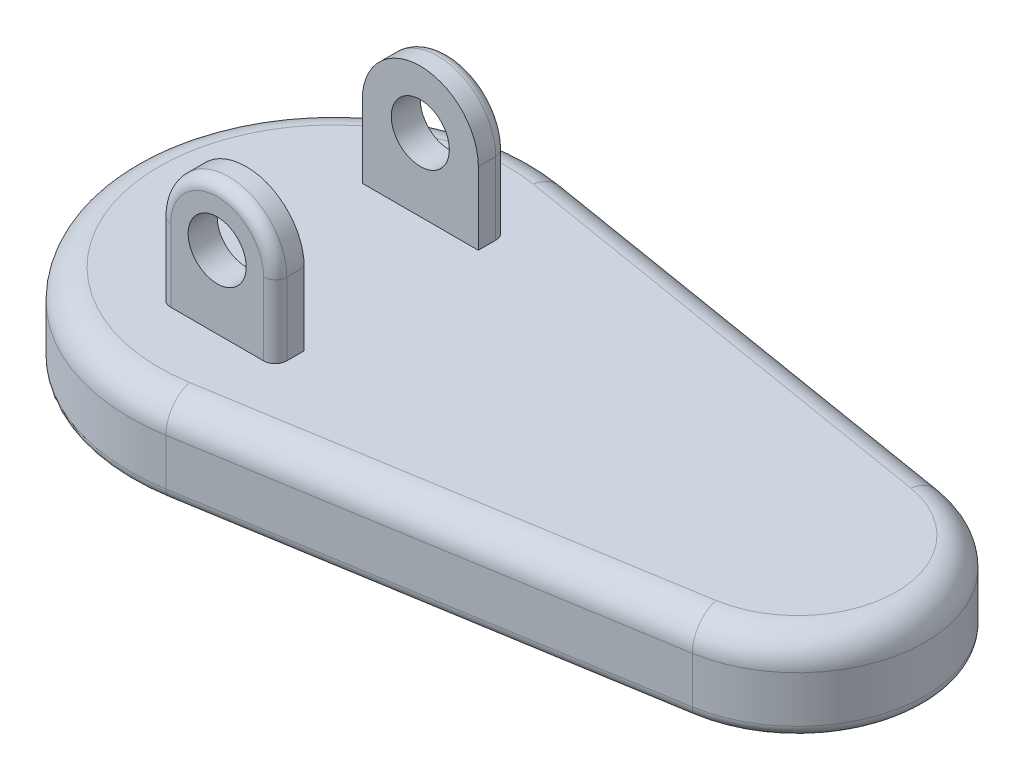
ISO-10303-21;
HEADER;
FILE_DESCRIPTION(('STEP AP214'),'2;1');
FILE_NAME('part.step','',(''),(''),'','','');
FILE_SCHEMA(('AUTOMOTIVE_DESIGN { 1 0 10303 214 1 1 1 1 }'));
ENDSEC;
DATA;
#1=APPLICATION_CONTEXT('core data for automotive mechanical design processes');
#2=APPLICATION_PROTOCOL_DEFINITION('international standard','automotive_design',2000,#1);
#3=PRODUCT_CONTEXT('',#1,'mechanical');
#4=PRODUCT('Part','Part','',(#3));
#5=PRODUCT_RELATED_PRODUCT_CATEGORY('part','',(#4));
#6=PRODUCT_DEFINITION_FORMATION('','',#4);
#7=PRODUCT_DEFINITION_CONTEXT('part definition',#1,'design');
#8=PRODUCT_DEFINITION('design','',#6,#7);
#9=PRODUCT_DEFINITION_SHAPE('','',#8);
#10=(LENGTH_UNIT() NAMED_UNIT(*) SI_UNIT(.MILLI.,.METRE.));
#11=(NAMED_UNIT(*) PLANE_ANGLE_UNIT() SI_UNIT($,.RADIAN.));
#12=(NAMED_UNIT(*) SI_UNIT($,.STERADIAN.) SOLID_ANGLE_UNIT());
#13=UNCERTAINTY_MEASURE_WITH_UNIT(LENGTH_MEASURE(1.E-05),#10,'distance_accuracy_value','');
#14=(GEOMETRIC_REPRESENTATION_CONTEXT(3) GLOBAL_UNCERTAINTY_ASSIGNED_CONTEXT((#13)) GLOBAL_UNIT_ASSIGNED_CONTEXT((#10,
#11,#12)) REPRESENTATION_CONTEXT('',''));
#15=CARTESIAN_POINT('',(0.,0.,0.));
#16=DIRECTION('',(0.,0.,1.));
#17=DIRECTION('',(1.,0.,0.));
#18=AXIS2_PLACEMENT_3D('',#15,#16,#17);
#19=CARTESIAN_POINT('',(0.,57.15,-25.4));
#20=DIRECTION('',(0.,0.,-1.));
#21=DIRECTION('',(-1.,0.,0.));
#22=AXIS2_PLACEMENT_3D('',#19,#20,#21);
#23=PLANE('',#22);
#24=CARTESIAN_POINT('',(-101.6,34.925,-25.4));
#25=DIRECTION('',(0.,0.,-1.));
#26=DIRECTION('',(-1.,0.,0.));
#27=AXIS2_PLACEMENT_3D('',#24,#25,#26);
#28=CIRCLE('',#27,10.16);
#29=CARTESIAN_POINT('',(-111.76,34.925,-25.4));
#30=VERTEX_POINT('',#29);
#31=CARTESIAN_POINT('',(-91.44,34.925,-25.4));
#32=VERTEX_POINT('',#31);
#33=EDGE_CURVE('E288',#30,#32,#28,.T.);
#34=ORIENTED_EDGE('',*,*,#33,.T.);
#35=DIRECTION('',(0.,-1.,0.));
#36=VECTOR('',#35,1.);
#37=CARTESIAN_POINT('',(-91.44,57.15,-25.4));
#38=LINE('',#37,#36);
#39=CARTESIAN_POINT('',(-91.44,19.05,-25.4));
#40=VERTEX_POINT('',#39);
#41=EDGE_CURVE('E302',#32,#40,#38,.T.);
#42=ORIENTED_EDGE('',*,*,#41,.T.);
#43=DIRECTION('',(1.,0.,0.));
#44=VECTOR('',#43,1.);
#45=CARTESIAN_POINT('',(0.,19.05,-25.4));
#46=LINE('',#45,#44);
#47=CARTESIAN_POINT('',(-111.76,19.05,-25.4));
#48=VERTEX_POINT('',#47);
#49=EDGE_CURVE('E372',#48,#40,#46,.T.);
#50=ORIENTED_EDGE('',*,*,#49,.F.);
#51=DIRECTION('',(0.,-1.,0.));
#52=VECTOR('',#51,1.);
#53=CARTESIAN_POINT('',(-111.76,34.925,-25.4));
#54=LINE('',#53,#52);
#55=EDGE_CURVE('E300',#48,#30,#54,.F.);
#56=ORIENTED_EDGE('',*,*,#55,.T.);
#57=EDGE_LOOP('',(#34,#42,#50,#56));
#58=FACE_BOUND('',#57,.T.);
#59=CARTESIAN_POINT('',(-101.6,34.925,-25.4));
#60=DIRECTION('',(0.,0.,-1.));
#61=DIRECTION('',(-1.,0.,0.));
#62=AXIS2_PLACEMENT_3D('',#59,#60,#61);
#63=CIRCLE('',#62,6.35);
#64=CARTESIAN_POINT('',(-95.25,34.925,-25.4));
#65=VERTEX_POINT('',#64);
#66=EDGE_CURVE('E359',#65,#65,#63,.T.);
#67=ORIENTED_EDGE('',*,*,#66,.F.);
#68=EDGE_LOOP('',(#67));
#69=FACE_BOUND('',#68,.T.);
#70=ADVANCED_FACE('F50',(#58,#69),#23,.T.);
#71=CARTESIAN_POINT('',(0.,57.15,-19.05));
#72=DIRECTION('',(0.,0.,-1.));
#73=DIRECTION('',(-1.,0.,0.));
#74=AXIS2_PLACEMENT_3D('',#71,#72,#73);
#75=PLANE('',#74);
#76=DIRECTION('',(0.,-1.,0.));
#77=VECTOR('',#76,1.);
#78=CARTESIAN_POINT('',(-88.9,57.15,-19.05));
#79=LINE('',#78,#77);
#80=CARTESIAN_POINT('',(-88.9,34.925,-19.05));
#81=VERTEX_POINT('',#80);
#82=CARTESIAN_POINT('',(-88.9,19.05,-19.05));
#83=VERTEX_POINT('',#82);
#84=EDGE_CURVE('E194',#81,#83,#79,.T.);
#85=ORIENTED_EDGE('',*,*,#84,.F.);
#86=CARTESIAN_POINT('',(-101.6,34.925,-19.05));
#87=DIRECTION('',(0.,0.,-1.));
#88=DIRECTION('',(-1.,0.,0.));
#89=AXIS2_PLACEMENT_3D('',#86,#87,#88);
#90=CIRCLE('',#89,12.7);
#91=CARTESIAN_POINT('',(-114.3,34.925,-19.05));
#92=VERTEX_POINT('',#91);
#93=EDGE_CURVE('E200',#81,#92,#90,.F.);
#94=ORIENTED_EDGE('',*,*,#93,.T.);
#95=DIRECTION('',(0.,-1.,0.));
#96=VECTOR('',#95,1.);
#97=CARTESIAN_POINT('',(-114.3,57.15,-19.05));
#98=LINE('',#97,#96);
#99=CARTESIAN_POINT('',(-114.3,19.05,-19.05));
#100=VERTEX_POINT('',#99);
#101=EDGE_CURVE('E216',#92,#100,#98,.T.);
#102=ORIENTED_EDGE('',*,*,#101,.T.);
#103=DIRECTION('',(1.,0.,0.));
#104=VECTOR('',#103,1.);
#105=CARTESIAN_POINT('',(0.,19.05,-19.05));
#106=LINE('',#105,#104);
#107=EDGE_CURVE('E215',#100,#83,#106,.T.);
#108=ORIENTED_EDGE('',*,*,#107,.T.);
#109=EDGE_LOOP('',(#85,#94,#102,#108));
#110=FACE_BOUND('',#109,.T.);
#111=CARTESIAN_POINT('',(-101.6,34.925,-19.05));
#112=DIRECTION('',(0.,0.,-1.));
#113=DIRECTION('',(-1.,0.,0.));
#114=AXIS2_PLACEMENT_3D('',#111,#112,#113);
#115=CIRCLE('',#114,6.35);
#116=CARTESIAN_POINT('',(-95.25,34.925,-19.05));
#117=VERTEX_POINT('',#116);
#118=EDGE_CURVE('E240',#117,#117,#115,.T.);
#119=ORIENTED_EDGE('',*,*,#118,.T.);
#120=EDGE_LOOP('',(#119));
#121=FACE_BOUND('',#120,.T.);
#122=ADVANCED_FACE('F212',(#110,#121),#75,.F.);
#123=CARTESIAN_POINT('',(-114.3,57.15,0.));
#124=DIRECTION('',(-1.,0.,0.));
#125=DIRECTION('',(0.,0.,1.));
#126=AXIS2_PLACEMENT_3D('',#123,#124,#125);
#127=PLANE('',#126);
#128=DIRECTION('',(0.,0.,-1.));
#129=VECTOR('',#128,1.);
#130=CARTESIAN_POINT('',(-114.3,19.05,0.));
#131=LINE('',#130,#129);
#132=CARTESIAN_POINT('',(-114.3,19.05,22.86));
#133=VERTEX_POINT('',#132);
#134=CARTESIAN_POINT('',(-114.3,19.05,19.05));
#135=VERTEX_POINT('',#134);
#136=EDGE_CURVE('E355',#133,#135,#131,.T.);
#137=ORIENTED_EDGE('',*,*,#136,.F.);
#138=DIRECTION('',(0.,-1.,0.));
#139=VECTOR('',#138,1.);
#140=CARTESIAN_POINT('',(-114.3,34.925,22.86));
#141=LINE('',#140,#139);
#142=CARTESIAN_POINT('',(-114.3,34.925,22.86));
#143=VERTEX_POINT('',#142);
#144=EDGE_CURVE('E315',#133,#143,#141,.F.);
#145=ORIENTED_EDGE('',*,*,#144,.T.);
#146=DIRECTION('',(0.,0.,1.));
#147=VECTOR('',#146,1.);
#148=CARTESIAN_POINT('',(-114.3,34.925,-44.45));
#149=LINE('',#148,#147);
#150=CARTESIAN_POINT('',(-114.3,34.925,19.05));
#151=VERTEX_POINT('',#150);
#152=EDGE_CURVE('E387',#151,#143,#149,.T.);
#153=ORIENTED_EDGE('',*,*,#152,.F.);
#154=DIRECTION('',(0.,-1.,0.));
#155=VECTOR('',#154,1.);
#156=CARTESIAN_POINT('',(-114.3,57.15,19.05));
#157=LINE('',#156,#155);
#158=EDGE_CURVE('E364',#151,#135,#157,.T.);
#159=ORIENTED_EDGE('',*,*,#158,.T.);
#160=EDGE_LOOP('',(#137,#145,#153,#159));
#161=FACE_BOUND('',#160,.T.);
#162=ADVANCED_FACE('F409',(#161),#127,.T.);
#163=CARTESIAN_POINT('',(0.,57.15,25.4));
#164=DIRECTION('',(0.,0.,-1.));
#165=DIRECTION('',(-1.,0.,0.));
#166=AXIS2_PLACEMENT_3D('',#163,#164,#165);
#167=PLANE('',#166);
#168=CARTESIAN_POINT('',(-101.6,34.925,25.4));
#169=DIRECTION('',(0.,0.,-1.));
#170=DIRECTION('',(-1.,0.,0.));
#171=AXIS2_PLACEMENT_3D('',#168,#169,#170);
#172=CIRCLE('',#171,10.16);
#173=CARTESIAN_POINT('',(-91.44,34.925,25.4));
#174=VERTEX_POINT('',#173);
#175=CARTESIAN_POINT('',(-111.76,34.925,25.4));
#176=VERTEX_POINT('',#175);
#177=EDGE_CURVE('E308',#174,#176,#172,.F.);
#178=ORIENTED_EDGE('',*,*,#177,.T.);
#179=DIRECTION('',(0.,-1.,0.));
#180=VECTOR('',#179,1.);
#181=CARTESIAN_POINT('',(-111.76,19.05,25.4));
#182=LINE('',#181,#180);
#183=CARTESIAN_POINT('',(-111.76,19.05,25.4));
#184=VERTEX_POINT('',#183);
#185=EDGE_CURVE('E312',#176,#184,#182,.T.);
#186=ORIENTED_EDGE('',*,*,#185,.T.);
#187=DIRECTION('',(1.,0.,0.));
#188=VECTOR('',#187,1.);
#189=CARTESIAN_POINT('',(0.,19.05,25.4));
#190=LINE('',#189,#188);
#191=CARTESIAN_POINT('',(-91.44,19.05,25.4));
#192=VERTEX_POINT('',#191);
#193=EDGE_CURVE('E349',#184,#192,#190,.T.);
#194=ORIENTED_EDGE('',*,*,#193,.T.);
#195=DIRECTION('',(0.,-1.,0.));
#196=VECTOR('',#195,1.);
#197=CARTESIAN_POINT('',(-91.44,57.15,25.4));
#198=LINE('',#197,#196);
#199=EDGE_CURVE('E310',#192,#174,#198,.F.);
#200=ORIENTED_EDGE('',*,*,#199,.T.);
#201=EDGE_LOOP('',(#178,#186,#194,#200));
#202=FACE_BOUND('',#201,.T.);
#203=CARTESIAN_POINT('',(-101.6,34.925,25.4));
#204=DIRECTION('',(0.,0.,1.));
#205=DIRECTION('',(1.,0.,0.));
#206=AXIS2_PLACEMENT_3D('',#203,#204,#205);
#207=CIRCLE('',#206,6.35);
#208=CARTESIAN_POINT('',(-95.25,34.925,25.4));
#209=VERTEX_POINT('',#208);
#210=EDGE_CURVE('E270',#209,#209,#207,.T.);
#211=ORIENTED_EDGE('',*,*,#210,.F.);
#212=EDGE_LOOP('',(#211));
#213=FACE_BOUND('',#212,.T.);
#214=ADVANCED_FACE('F353',(#202,#213),#167,.F.);
#215=CARTESIAN_POINT('',(-88.9,57.15,0.));
#216=DIRECTION('',(-1.,0.,0.));
#217=DIRECTION('',(0.,0.,1.));
#218=AXIS2_PLACEMENT_3D('',#215,#216,#217);
#219=PLANE('',#218);
#220=DIRECTION('',(0.,0.,1.));
#221=VECTOR('',#220,1.);
#222=CARTESIAN_POINT('',(-88.9,34.925,-44.45));
#223=LINE('',#222,#221);
#224=CARTESIAN_POINT('',(-88.9,34.925,19.05));
#225=VERTEX_POINT('',#224);
#226=CARTESIAN_POINT('',(-88.9,34.925,22.86));
#227=VERTEX_POINT('',#226);
#228=EDGE_CURVE('E201',#225,#227,#223,.T.);
#229=ORIENTED_EDGE('',*,*,#228,.T.);
#230=DIRECTION('',(0.,-1.,0.));
#231=VECTOR('',#230,1.);
#232=CARTESIAN_POINT('',(-88.9,57.15,22.86));
#233=LINE('',#232,#231);
#234=CARTESIAN_POINT('',(-88.9,19.05,22.86));
#235=VERTEX_POINT('',#234);
#236=EDGE_CURVE('E67',#227,#235,#233,.T.);
#237=ORIENTED_EDGE('',*,*,#236,.T.);
#238=DIRECTION('',(0.,0.,-1.));
#239=VECTOR('',#238,1.);
#240=CARTESIAN_POINT('',(-88.9,19.05,0.));
#241=LINE('',#240,#239);
#242=CARTESIAN_POINT('',(-88.9,19.05,19.05));
#243=VERTEX_POINT('',#242);
#244=EDGE_CURVE('E351',#235,#243,#241,.T.);
#245=ORIENTED_EDGE('',*,*,#244,.T.);
#246=DIRECTION('',(0.,-1.,0.));
#247=VECTOR('',#246,1.);
#248=CARTESIAN_POINT('',(-88.9,57.15,19.05));
#249=LINE('',#248,#247);
#250=EDGE_CURVE('E367',#225,#243,#249,.T.);
#251=ORIENTED_EDGE('',*,*,#250,.F.);
#252=EDGE_LOOP('',(#229,#237,#245,#251));
#253=FACE_BOUND('',#252,.T.);
#254=ADVANCED_FACE('F408',(#253),#219,.F.);
#255=CARTESIAN_POINT('',(0.,57.15,19.05));
#256=DIRECTION('',(0.,0.,-1.));
#257=DIRECTION('',(-1.,0.,0.));
#258=AXIS2_PLACEMENT_3D('',#255,#256,#257);
#259=PLANE('',#258);
#260=CARTESIAN_POINT('',(-101.6,34.925,19.05));
#261=DIRECTION('',(0.,0.,-1.));
#262=DIRECTION('',(-1.,0.,0.));
#263=AXIS2_PLACEMENT_3D('',#260,#261,#262);
#264=CIRCLE('',#263,12.7);
#265=EDGE_CURVE('E235',#225,#151,#264,.F.);
#266=ORIENTED_EDGE('',*,*,#265,.F.);
#267=ORIENTED_EDGE('',*,*,#250,.T.);
#268=DIRECTION('',(1.,0.,0.));
#269=VECTOR('',#268,1.);
#270=CARTESIAN_POINT('',(0.,19.05,19.05));
#271=LINE('',#270,#269);
#272=EDGE_CURVE('E357',#135,#243,#271,.T.);
#273=ORIENTED_EDGE('',*,*,#272,.F.);
#274=ORIENTED_EDGE('',*,*,#158,.F.);
#275=EDGE_LOOP('',(#266,#267,#273,#274));
#276=FACE_BOUND('',#275,.T.);
#277=CARTESIAN_POINT('',(-101.6,34.925,19.05));
#278=DIRECTION('',(0.,0.,-1.));
#279=DIRECTION('',(-1.,0.,0.));
#280=AXIS2_PLACEMENT_3D('',#277,#278,#279);
#281=CIRCLE('',#280,6.35);
#282=CARTESIAN_POINT('',(-107.95,34.925,19.05));
#283=VERTEX_POINT('',#282);
#284=EDGE_CURVE('E210',#283,#283,#281,.T.);
#285=ORIENTED_EDGE('',*,*,#284,.F.);
#286=EDGE_LOOP('',(#285));
#287=FACE_BOUND('',#286,.T.);
#288=ADVANCED_FACE('F415',(#276,#287),#259,.T.);
#289=CARTESIAN_POINT('',(-101.6,19.05,0.));
#290=DIRECTION('',(0.,-1.,0.));
#291=DIRECTION('',(0.,0.,-1.));
#292=AXIS2_PLACEMENT_3D('',#289,#290,#291);
#293=CYLINDRICAL_SURFACE('',#292,44.45);
#294=DIRECTION('',(0.,-1.,0.));
#295=VECTOR('',#294,1.);
#296=CARTESIAN_POINT('',(-94.376875,19.05,-43.8591947627219));
#297=LINE('',#296,#295);
#298=CARTESIAN_POINT('',(-94.376875,12.7,-43.8591947627219));
#299=VERTEX_POINT('',#298);
#300=CARTESIAN_POINT('',(-94.376875,2.54000000000001,-43.8591947627219));
#301=VERTEX_POINT('',#300);
#302=EDGE_CURVE('E218',#299,#301,#297,.T.);
#303=ORIENTED_EDGE('',*,*,#302,.T.);
#304=CARTESIAN_POINT('',(-101.6,2.54,0.));
#305=DIRECTION('',(0.,1.,0.));
#306=DIRECTION('',(0.,0.,1.));
#307=AXIS2_PLACEMENT_3D('',#304,#305,#306);
#308=CIRCLE('',#307,44.45);
#309=CARTESIAN_POINT('',(-94.376875,2.54000000000001,43.8591947627219));
#310=VERTEX_POINT('',#309);
#311=EDGE_CURVE('E286',#301,#310,#308,.T.);
#312=ORIENTED_EDGE('',*,*,#311,.T.);
#313=DIRECTION('',(0.,-1.,0.));
#314=VECTOR('',#313,1.);
#315=CARTESIAN_POINT('',(-94.376875,19.05,43.8591947627219));
#316=LINE('',#315,#314);
#317=CARTESIAN_POINT('',(-94.376875,12.7,43.8591947627219));
#318=VERTEX_POINT('',#317);
#319=EDGE_CURVE('E232',#318,#310,#316,.T.);
#320=ORIENTED_EDGE('',*,*,#319,.F.);
#321=CARTESIAN_POINT('',(-101.6,12.7,0.));
#322=DIRECTION('',(0.,1.,0.));
#323=DIRECTION('',(0.,0.,1.));
#324=AXIS2_PLACEMENT_3D('',#321,#322,#323);
#325=CIRCLE('',#324,44.45);
#326=EDGE_CURVE('E254',#318,#299,#325,.F.);
#327=ORIENTED_EDGE('',*,*,#326,.T.);
#328=EDGE_LOOP('',(#303,#312,#320,#327));
#329=FACE_BOUND('',#328,.T.);
#330=ADVANCED_FACE('F446',(#329),#293,.T.);
#331=CARTESIAN_POINT('',(-94.376875,19.05,43.8591947627219));
#332=DIRECTION('',(-0.1625,0.,-0.986708543593295));
#333=DIRECTION('',(-0.986708543593294,0.,0.1625));
#334=AXIS2_PLACEMENT_3D('',#331,#332,#333);
#335=PLANE('',#334);
#336=ORIENTED_EDGE('',*,*,#319,.T.);
#337=DIRECTION('',(0.986708543593294,0.,-0.1625));
#338=VECTOR('',#337,1.);
#339=CARTESIAN_POINT('',(-94.376875,2.54,43.8591947627219));
#340=LINE('',#339,#338);
#341=CARTESIAN_POINT('',(4.54025,2.54000000000001,27.5686367079966));
#342=VERTEX_POINT('',#341);
#343=EDGE_CURVE('E284',#310,#342,#340,.T.);
#344=ORIENTED_EDGE('',*,*,#343,.T.);
#345=DIRECTION('',(0.,-1.,0.));
#346=VECTOR('',#345,1.);
#347=CARTESIAN_POINT('',(4.54025,19.05,27.5686367079966));
#348=LINE('',#347,#346);
#349=CARTESIAN_POINT('',(4.54025,12.7,27.5686367079966));
#350=VERTEX_POINT('',#349);
#351=EDGE_CURVE('E229',#350,#342,#348,.T.);
#352=ORIENTED_EDGE('',*,*,#351,.F.);
#353=DIRECTION('',(0.986708543593294,0.,-0.1625));
#354=VECTOR('',#353,1.);
#355=CARTESIAN_POINT('',(-94.376875,12.7,43.8591947627219));
#356=LINE('',#355,#354);
#357=EDGE_CURVE('E252',#350,#318,#356,.F.);
#358=ORIENTED_EDGE('',*,*,#357,.T.);
#359=EDGE_LOOP('',(#336,#344,#352,#358));
#360=FACE_BOUND('',#359,.T.);
#361=ADVANCED_FACE('F442',(#360),#335,.F.);
#362=CARTESIAN_POINT('',(0.,19.05,0.));
#363=DIRECTION('',(0.,-1.,0.));
#364=DIRECTION('',(0.,0.,-1.));
#365=AXIS2_PLACEMENT_3D('',#362,#363,#364);
#366=CYLINDRICAL_SURFACE('',#365,27.94);
#367=ORIENTED_EDGE('',*,*,#351,.T.);
#368=CARTESIAN_POINT('',(0.,2.54,0.));
#369=DIRECTION('',(0.,1.,0.));
#370=DIRECTION('',(0.,0.,1.));
#371=AXIS2_PLACEMENT_3D('',#368,#369,#370);
#372=CIRCLE('',#371,27.94);
#373=CARTESIAN_POINT('',(4.54025,2.54000000000001,-27.5686367079966));
#374=VERTEX_POINT('',#373);
#375=EDGE_CURVE('E282',#342,#374,#372,.T.);
#376=ORIENTED_EDGE('',*,*,#375,.T.);
#377=DIRECTION('',(0.,-1.,0.));
#378=VECTOR('',#377,1.);
#379=CARTESIAN_POINT('',(4.54025,19.05,-27.5686367079966));
#380=LINE('',#379,#378);
#381=CARTESIAN_POINT('',(4.54025,12.7,-27.5686367079966));
#382=VERTEX_POINT('',#381);
#383=EDGE_CURVE('E226',#382,#374,#380,.T.);
#384=ORIENTED_EDGE('',*,*,#383,.F.);
#385=CARTESIAN_POINT('',(0.,12.7,0.));
#386=DIRECTION('',(0.,1.,0.));
#387=DIRECTION('',(0.,0.,1.));
#388=AXIS2_PLACEMENT_3D('',#385,#386,#387);
#389=CIRCLE('',#388,27.94);
#390=EDGE_CURVE('E249',#382,#350,#389,.F.);
#391=ORIENTED_EDGE('',*,*,#390,.T.);
#392=EDGE_LOOP('',(#367,#376,#384,#391));
#393=FACE_BOUND('',#392,.T.);
#394=ADVANCED_FACE('F438',(#393),#366,.T.);
#395=CARTESIAN_POINT('',(-94.376875,19.05,-43.8591947627219));
#396=DIRECTION('',(-0.1625,0.,0.986708543593295));
#397=DIRECTION('',(0.986708543593294,0.,0.1625));
#398=AXIS2_PLACEMENT_3D('',#395,#396,#397);
#399=PLANE('',#398);
#400=ORIENTED_EDGE('',*,*,#383,.T.);
#401=DIRECTION('',(-0.986708543593294,0.,-0.1625));
#402=VECTOR('',#401,1.);
#403=CARTESIAN_POINT('',(-94.376875,2.54,-43.8591947627219));
#404=LINE('',#403,#402);
#405=EDGE_CURVE('E258',#374,#301,#404,.T.);
#406=ORIENTED_EDGE('',*,*,#405,.T.);
#407=ORIENTED_EDGE('',*,*,#302,.F.);
#408=DIRECTION('',(-0.986708543593294,0.,-0.1625));
#409=VECTOR('',#408,1.);
#410=CARTESIAN_POINT('',(4.54025,12.7,-27.5686367079966));
#411=LINE('',#410,#409);
#412=EDGE_CURVE('E256',#299,#382,#411,.F.);
#413=ORIENTED_EDGE('',*,*,#412,.T.);
#414=EDGE_LOOP('',(#400,#406,#407,#413));
#415=FACE_BOUND('',#414,.T.);
#416=ADVANCED_FACE('F431',(#415),#399,.F.);
#417=CARTESIAN_POINT('',(-101.6,19.05,0.));
#418=DIRECTION('',(0.,1.,0.));
#419=DIRECTION('',(0.,0.,1.));
#420=AXIS2_PLACEMENT_3D('',#417,#418,#419);
#421=PLANE('',#420);
#422=DIRECTION('',(0.986708543593294,0.,-0.1625));
#423=VECTOR('',#422,1.);
#424=CARTESIAN_POINT('',(3.50837499999999,19.05,21.3030374561792));
#425=LINE('',#424,#423);
#426=CARTESIAN_POINT('',(-95.40875,19.05,37.5935955109045));
#427=VERTEX_POINT('',#426);
#428=CARTESIAN_POINT('',(3.508375,19.05,21.3030374561792));
#429=VERTEX_POINT('',#428);
#430=EDGE_CURVE('E244',#427,#429,#425,.T.);
#431=ORIENTED_EDGE('',*,*,#430,.T.);
#432=CARTESIAN_POINT('',(0.,19.05,0.));
#433=DIRECTION('',(0.,1.,0.));
#434=DIRECTION('',(0.,0.,1.));
#435=AXIS2_PLACEMENT_3D('',#432,#433,#434);
#436=CIRCLE('',#435,21.59);
#437=CARTESIAN_POINT('',(3.508375,19.05,-21.3030374561792));
#438=VERTEX_POINT('',#437);
#439=EDGE_CURVE('E246',#429,#438,#436,.T.);
#440=ORIENTED_EDGE('',*,*,#439,.T.);
#441=DIRECTION('',(-0.986708543593294,0.,-0.1625));
#442=VECTOR('',#441,1.);
#443=CARTESIAN_POINT('',(-95.40875,19.05,-37.5935955109045));
#444=LINE('',#443,#442);
#445=CARTESIAN_POINT('',(-95.40875,19.05,-37.5935955109045));
#446=VERTEX_POINT('',#445);
#447=EDGE_CURVE('E237',#438,#446,#444,.T.);
#448=ORIENTED_EDGE('',*,*,#447,.T.);
#449=CARTESIAN_POINT('',(-101.6,19.05,0.));
#450=DIRECTION('',(0.,1.,0.));
#451=DIRECTION('',(0.,0.,1.));
#452=AXIS2_PLACEMENT_3D('',#449,#450,#451);
#453=CIRCLE('',#452,38.1);
#454=EDGE_CURVE('E242',#446,#427,#453,.T.);
#455=ORIENTED_EDGE('',*,*,#454,.T.);
#456=EDGE_LOOP('',(#431,#440,#448,#455));
#457=FACE_BOUND('',#456,.T.);
#458=ORIENTED_EDGE('',*,*,#193,.F.);
#459=CARTESIAN_POINT('',(-111.76,19.05,22.86));
#460=DIRECTION('',(0.,1.,0.));
#461=DIRECTION('',(0.,0.,1.));
#462=AXIS2_PLACEMENT_3D('',#459,#460,#461);
#463=CIRCLE('',#462,2.54);
#464=EDGE_CURVE('E59',#184,#133,#463,.F.);
#465=ORIENTED_EDGE('',*,*,#464,.T.);
#466=ORIENTED_EDGE('',*,*,#136,.T.);
#467=ORIENTED_EDGE('',*,*,#272,.T.);
#468=ORIENTED_EDGE('',*,*,#244,.F.);
#469=CARTESIAN_POINT('',(-91.44,19.05,22.86));
#470=DIRECTION('',(0.,1.,0.));
#471=DIRECTION('',(0.,0.,1.));
#472=AXIS2_PLACEMENT_3D('',#469,#470,#471);
#473=CIRCLE('',#472,2.54);
#474=EDGE_CURVE('E12',#235,#192,#473,.F.);
#475=ORIENTED_EDGE('',*,*,#474,.T.);
#476=EDGE_LOOP('',(#458,#465,#466,#467,#468,#475));
#477=FACE_BOUND('',#476,.T.);
#478=ORIENTED_EDGE('',*,*,#49,.T.);
#479=CARTESIAN_POINT('',(-91.44,19.05,-22.86));
#480=DIRECTION('',(0.,1.,0.));
#481=DIRECTION('',(0.,0.,1.));
#482=AXIS2_PLACEMENT_3D('',#479,#480,#481);
#483=CIRCLE('',#482,2.54);
#484=CARTESIAN_POINT('',(-88.9,19.05,-22.86));
#485=VERTEX_POINT('',#484);
#486=EDGE_CURVE('E321',#40,#485,#483,.F.);
#487=ORIENTED_EDGE('',*,*,#486,.T.);
#488=DIRECTION('',(0.,0.,1.));
#489=VECTOR('',#488,1.);
#490=CARTESIAN_POINT('',(-88.9,19.05,0.));
#491=LINE('',#490,#489);
#492=EDGE_CURVE('E370',#485,#83,#491,.T.);
#493=ORIENTED_EDGE('',*,*,#492,.T.);
#494=ORIENTED_EDGE('',*,*,#107,.F.);
#495=DIRECTION('',(0.,0.,1.));
#496=VECTOR('',#495,1.);
#497=CARTESIAN_POINT('',(-114.3,19.05,0.));
#498=LINE('',#497,#496);
#499=CARTESIAN_POINT('',(-114.3,19.05,-22.86));
#500=VERTEX_POINT('',#499);
#501=EDGE_CURVE('E220',#500,#100,#498,.T.);
#502=ORIENTED_EDGE('',*,*,#501,.F.);
#503=CARTESIAN_POINT('',(-111.76,19.05,-22.86));
#504=DIRECTION('',(0.,1.,0.));
#505=DIRECTION('',(0.,0.,1.));
#506=AXIS2_PLACEMENT_3D('',#503,#504,#505);
#507=CIRCLE('',#506,2.54);
#508=EDGE_CURVE('E323',#500,#48,#507,.F.);
#509=ORIENTED_EDGE('',*,*,#508,.T.);
#510=EDGE_LOOP('',(#478,#487,#493,#494,#502,#509));
#511=FACE_BOUND('',#510,.T.);
#512=ADVANCED_FACE('F347',(#457,#477,#511),#421,.T.);
#513=CARTESIAN_POINT('',(-101.6,0.,0.));
#514=DIRECTION('',(0.,1.,0.));
#515=DIRECTION('',(0.,0.,1.));
#516=AXIS2_PLACEMENT_3D('',#513,#514,#515);
#517=PLANE('',#516);
#518=CARTESIAN_POINT('',(-101.6,0.,0.));
#519=DIRECTION('',(0.,1.,0.));
#520=DIRECTION('',(0.,0.,1.));
#521=AXIS2_PLACEMENT_3D('',#518,#519,#520);
#522=CIRCLE('',#521,41.91);
#523=CARTESIAN_POINT('',(-94.789625,0.,41.352955061995));
#524=VERTEX_POINT('',#523);
#525=CARTESIAN_POINT('',(-94.789625,0.,-41.352955061995));
#526=VERTEX_POINT('',#525);
#527=EDGE_CURVE('E273',#524,#526,#522,.F.);
#528=ORIENTED_EDGE('',*,*,#527,.T.);
#529=DIRECTION('',(-0.986708543593294,0.,-0.1625));
#530=VECTOR('',#529,1.);
#531=CARTESIAN_POINT('',(-94.789625,0.,-41.352955061995));
#532=LINE('',#531,#530);
#533=CARTESIAN_POINT('',(4.1275,0.,-25.0623970072697));
#534=VERTEX_POINT('',#533);
#535=EDGE_CURVE('E279',#526,#534,#532,.F.);
#536=ORIENTED_EDGE('',*,*,#535,.T.);
#537=CARTESIAN_POINT('',(0.,0.,0.));
#538=DIRECTION('',(0.,1.,0.));
#539=DIRECTION('',(0.,0.,1.));
#540=AXIS2_PLACEMENT_3D('',#537,#538,#539);
#541=CIRCLE('',#540,25.4);
#542=CARTESIAN_POINT('',(4.1275,0.,25.0623970072697));
#543=VERTEX_POINT('',#542);
#544=EDGE_CURVE('E277',#534,#543,#541,.F.);
#545=ORIENTED_EDGE('',*,*,#544,.T.);
#546=DIRECTION('',(0.986708543593294,0.,-0.1625));
#547=VECTOR('',#546,1.);
#548=CARTESIAN_POINT('',(-94.789625,0.,41.3529550619949));
#549=LINE('',#548,#547);
#550=EDGE_CURVE('E275',#543,#524,#549,.F.);
#551=ORIENTED_EDGE('',*,*,#550,.T.);
#552=EDGE_LOOP('',(#528,#536,#545,#551));
#553=FACE_BOUND('',#552,.T.);
#554=ADVANCED_FACE('F428',(#553),#517,.F.);
#555=CARTESIAN_POINT('',(-88.9,57.15,0.));
#556=DIRECTION('',(1.,0.,0.));
#557=DIRECTION('',(0.,0.,-1.));
#558=AXIS2_PLACEMENT_3D('',#555,#556,#557);
#559=PLANE('',#558);
#560=ORIENTED_EDGE('',*,*,#492,.F.);
#561=DIRECTION('',(0.,-1.,0.));
#562=VECTOR('',#561,1.);
#563=CARTESIAN_POINT('',(-88.9,57.15,-22.86));
#564=LINE('',#563,#562);
#565=CARTESIAN_POINT('',(-88.9,34.925,-22.86));
#566=VERTEX_POINT('',#565);
#567=EDGE_CURVE('E197',#485,#566,#564,.F.);
#568=ORIENTED_EDGE('',*,*,#567,.T.);
#569=EDGE_CURVE('E189',#566,#81,#223,.T.);
#570=ORIENTED_EDGE('',*,*,#569,.T.);
#571=ORIENTED_EDGE('',*,*,#84,.T.);
#572=EDGE_LOOP('',(#560,#568,#570,#571));
#573=FACE_BOUND('',#572,.T.);
#574=ADVANCED_FACE('F192',(#573),#559,.T.);
#575=CARTESIAN_POINT('',(-114.3,57.15,0.));
#576=DIRECTION('',(1.,0.,0.));
#577=DIRECTION('',(0.,0.,-1.));
#578=AXIS2_PLACEMENT_3D('',#575,#576,#577);
#579=PLANE('',#578);
#580=CARTESIAN_POINT('',(-114.3,34.925,-22.86));
#581=VERTEX_POINT('',#580);
#582=EDGE_CURVE('E206',#581,#92,#149,.T.);
#583=ORIENTED_EDGE('',*,*,#582,.F.);
#584=DIRECTION('',(0.,-1.,0.));
#585=VECTOR('',#584,1.);
#586=CARTESIAN_POINT('',(-114.3,19.05,-22.86));
#587=LINE('',#586,#585);
#588=EDGE_CURVE('E306',#581,#500,#587,.T.);
#589=ORIENTED_EDGE('',*,*,#588,.T.);
#590=ORIENTED_EDGE('',*,*,#501,.T.);
#591=ORIENTED_EDGE('',*,*,#101,.F.);
#592=EDGE_LOOP('',(#583,#589,#590,#591));
#593=FACE_BOUND('',#592,.T.);
#594=ADVANCED_FACE('F376',(#593),#579,.F.);
#595=CARTESIAN_POINT('',(-101.6,34.925,-44.45));
#596=DIRECTION('',(0.,0.,1.));
#597=DIRECTION('',(1.,0.,0.));
#598=AXIS2_PLACEMENT_3D('',#595,#596,#597);
#599=CYLINDRICAL_SURFACE('',#598,12.7);
#600=ORIENTED_EDGE('',*,*,#152,.T.);
#601=CARTESIAN_POINT('',(-101.6,34.925,22.86));
#602=DIRECTION('',(0.,0.,-1.));
#603=DIRECTION('',(-1.,0.,0.));
#604=AXIS2_PLACEMENT_3D('',#601,#602,#603);
#605=CIRCLE('',#604,12.7);
#606=EDGE_CURVE('E75',#143,#227,#605,.T.);
#607=ORIENTED_EDGE('',*,*,#606,.T.);
#608=ORIENTED_EDGE('',*,*,#228,.F.);
#609=ORIENTED_EDGE('',*,*,#265,.T.);
#610=EDGE_LOOP('',(#600,#607,#608,#609));
#611=FACE_BOUND('',#610,.T.);
#612=ADVANCED_FACE('F424',(#611),#599,.T.);
#613=CARTESIAN_POINT('',(-101.6,34.925,-44.45));
#614=DIRECTION('',(0.,0.,1.));
#615=DIRECTION('',(1.,0.,0.));
#616=AXIS2_PLACEMENT_3D('',#613,#614,#615);
#617=CYLINDRICAL_SURFACE('',#616,6.35);
#618=ORIENTED_EDGE('',*,*,#284,.T.);
#619=EDGE_LOOP('',(#618));
#620=FACE_BOUND('',#619,.T.);
#621=ORIENTED_EDGE('',*,*,#210,.T.);
#622=EDGE_LOOP('',(#621));
#623=FACE_BOUND('',#622,.T.);
#624=ADVANCED_FACE('F406',(#620,#623),#617,.F.);
#625=ORIENTED_EDGE('',*,*,#569,.F.);
#626=CARTESIAN_POINT('',(-101.6,34.925,-22.86));
#627=DIRECTION('',(0.,0.,-1.));
#628=DIRECTION('',(-1.,0.,0.));
#629=AXIS2_PLACEMENT_3D('',#626,#627,#628);
#630=CIRCLE('',#629,12.7);
#631=EDGE_CURVE('E318',#566,#581,#630,.F.);
#632=ORIENTED_EDGE('',*,*,#631,.T.);
#633=ORIENTED_EDGE('',*,*,#582,.T.);
#634=ORIENTED_EDGE('',*,*,#93,.F.);
#635=EDGE_LOOP('',(#625,#632,#633,#634));
#636=FACE_BOUND('',#635,.T.);
#637=ADVANCED_FACE('F204',(#636),#599,.T.);
#638=CARTESIAN_POINT('',(-95.25,34.925,-25.4));
#639=CARTESIAN_POINT('',(-95.25,34.925,-25.3338541666667));
#640=CARTESIAN_POINT('',(-95.25,34.925,-25.2677083333333));
#641=CARTESIAN_POINT('',(-95.25,34.925,-25.1354166666667));
#642=CARTESIAN_POINT('',(-95.25,34.925,-25.0692708333333));
#643=CARTESIAN_POINT('',(-95.25,34.925,-24.9369791666667));
#644=CARTESIAN_POINT('',(-95.25,34.925,-24.8708333333333));
#645=CARTESIAN_POINT('',(-95.25,34.925,-24.7385416666667));
#646=CARTESIAN_POINT('',(-95.25,34.925,-24.6723958333333));
#647=CARTESIAN_POINT('',(-95.25,34.925,-24.5401041666667));
#648=CARTESIAN_POINT('',(-95.25,34.925,-24.4739583333333));
#649=CARTESIAN_POINT('',(-95.25,34.925,-24.3416666666667));
#650=CARTESIAN_POINT('',(-95.25,34.925,-24.2755208333333));
#651=CARTESIAN_POINT('',(-95.25,34.925,-24.1432291666667));
#652=CARTESIAN_POINT('',(-95.25,34.925,-24.0770833333333));
#653=CARTESIAN_POINT('',(-95.25,34.925,-23.9447916666667));
#654=CARTESIAN_POINT('',(-95.25,34.925,-23.8786458333333));
#655=CARTESIAN_POINT('',(-95.25,34.925,-23.7463541666667));
#656=CARTESIAN_POINT('',(-95.25,34.925,-23.6802083333333));
#657=CARTESIAN_POINT('',(-95.25,34.925,-23.5479166666667));
#658=CARTESIAN_POINT('',(-95.25,34.925,-23.4817708333333));
#659=CARTESIAN_POINT('',(-95.25,34.925,-23.3494791666667));
#660=CARTESIAN_POINT('',(-95.25,34.925,-23.2833333333333));
#661=CARTESIAN_POINT('',(-95.25,34.925,-23.1510416666667));
#662=CARTESIAN_POINT('',(-95.25,34.925,-23.0848958333333));
#663=CARTESIAN_POINT('',(-95.25,34.925,-22.9526041666667));
#664=CARTESIAN_POINT('',(-95.25,34.925,-22.8864583333333));
#665=CARTESIAN_POINT('',(-95.25,34.925,-22.7541666666667));
#666=CARTESIAN_POINT('',(-95.25,34.925,-22.6880208333333));
#667=CARTESIAN_POINT('',(-95.25,34.925,-22.5557291666667));
#668=CARTESIAN_POINT('',(-95.25,34.925,-22.4895833333333));
#669=CARTESIAN_POINT('',(-95.25,34.925,-22.3572916666667));
#670=CARTESIAN_POINT('',(-95.25,34.925,-22.2911458333333));
#671=CARTESIAN_POINT('',(-95.25,34.925,-22.1588541666667));
#672=CARTESIAN_POINT('',(-95.25,34.925,-22.0927083333333));
#673=CARTESIAN_POINT('',(-95.25,34.925,-21.9604166666667));
#674=CARTESIAN_POINT('',(-95.25,34.925,-21.8942708333333));
#675=CARTESIAN_POINT('',(-95.25,34.925,-21.7619791666667));
#676=CARTESIAN_POINT('',(-95.25,34.925,-21.6958333333333));
#677=CARTESIAN_POINT('',(-95.25,34.925,-21.5635416666667));
#678=CARTESIAN_POINT('',(-95.25,34.925,-21.4973958333333));
#679=CARTESIAN_POINT('',(-95.25,34.925,-21.3651041666667));
#680=CARTESIAN_POINT('',(-95.25,34.925,-21.2989583333333));
#681=CARTESIAN_POINT('',(-95.25,34.925,-21.1666666666667));
#682=CARTESIAN_POINT('',(-95.25,34.925,-21.1005208333333));
#683=CARTESIAN_POINT('',(-95.25,34.925,-20.9682291666667));
#684=CARTESIAN_POINT('',(-95.25,34.925,-20.9020833333333));
#685=CARTESIAN_POINT('',(-95.25,34.925,-20.7697916666667));
#686=CARTESIAN_POINT('',(-95.25,34.925,-20.7036458333333));
#687=CARTESIAN_POINT('',(-95.25,34.925,-20.5713541666667));
#688=CARTESIAN_POINT('',(-95.25,34.925,-20.5052083333333));
#689=CARTESIAN_POINT('',(-95.25,34.925,-20.3729166666667));
#690=CARTESIAN_POINT('',(-95.25,34.925,-20.3067708333333));
#691=CARTESIAN_POINT('',(-95.25,34.925,-20.1744791666667));
#692=CARTESIAN_POINT('',(-95.25,34.925,-20.1083333333333));
#693=CARTESIAN_POINT('',(-95.25,34.925,-19.9760416666667));
#694=CARTESIAN_POINT('',(-95.25,34.925,-19.9098958333333));
#695=CARTESIAN_POINT('',(-95.25,34.925,-19.7776041666667));
#696=CARTESIAN_POINT('',(-95.25,34.925,-19.7114583333333));
#697=CARTESIAN_POINT('',(-95.25,34.925,-19.5791666666667));
#698=CARTESIAN_POINT('',(-95.25,34.925,-19.5130208333333));
#699=CARTESIAN_POINT('',(-95.25,34.925,-19.3807291666667));
#700=CARTESIAN_POINT('',(-95.25,34.925,-19.3145833333333));
#701=CARTESIAN_POINT('',(-95.25,34.925,-19.1822916666667));
#702=CARTESIAN_POINT('',(-95.25,34.925,-19.1161458333333));
#703=CARTESIAN_POINT('',(-95.25,34.925,-19.05));
#704=B_SPLINE_CURVE_WITH_KNOTS('',3,(#638,#639,#640,#641,#642,#643,#644,#645,#646,#647,#648,
#649,#650,#651,#652,#653,#654,#655,#656,#657,#658,#659,#660,#661,#662,#663,#664,#665,#666,#667,
#668,#669,#670,#671,#672,#673,#674,#675,#676,#677,#678,#679,#680,#681,#682,#683,#684,#685,#686,
#687,#688,#689,#690,#691,#692,#693,#694,#695,#696,#697,#698,#699,#700,#701,#702,#703),
.UNSPECIFIED.,.F.,.F.,(4,2,2,2,2,2,2,2,2,2,2,2,2,2,2,2,2,2,2,2,2,2,2,2,2,2,2,2,2,2,2,2,4),(0.,
0.198437499999999,0.396875000000001,0.5953125,0.793749999999999,0.992187500000002,1.190625,
1.3890625,1.5875,1.7859375,1.984375,2.1828125,2.38125,2.5796875,2.778125,2.9765625,3.175,
3.3734375,3.571875,3.7703125,3.96875,4.1671875,4.365625,4.5640625,4.7625,4.9609375,5.159375,
5.3578125,5.55625,5.7546875,5.953125,6.1515625,6.35),.UNSPECIFIED.);
#705=EDGE_CURVE('BSEAM467',#65,#117,#704,.T.);
#706=ORIENTED_EDGE('',*,*,#66,.T.);
#707=ORIENTED_EDGE('',*,*,#118,.F.);
#708=ORIENTED_EDGE('',*,*,#705,.T.);
#709=ORIENTED_EDGE('',*,*,#705,.F.);
#710=EDGE_LOOP('',(#706,#708,#707,#709));
#711=FACE_BOUND('',#710,.T.);
#712=ADVANCED_FACE('F467',(#711),#617,.F.);
#713=CARTESIAN_POINT('',(-101.6,12.7,0.));
#714=DIRECTION('',(0.,1.,0.));
#715=DIRECTION('',(0.,0.,1.));
#716=AXIS2_PLACEMENT_3D('',#713,#714,#715);
#717=TOROIDAL_SURFACE('',#716,38.1,6.35);
#718=CARTESIAN_POINT('',(-95.40875,12.7,-37.5935955109045));
#719=DIRECTION('',(0.986708543593294,0.,0.1625));
#720=DIRECTION('',(0.1625,0.,-0.986708543593294));
#721=AXIS2_PLACEMENT_3D('',#718,#719,#720);
#722=CIRCLE('',#721,6.35);
#723=EDGE_CURVE('E264',#299,#446,#722,.T.);
#724=ORIENTED_EDGE('',*,*,#723,.F.);
#725=ORIENTED_EDGE('',*,*,#326,.F.);
#726=CARTESIAN_POINT('',(-95.40875,12.7,37.5935955109045));
#727=DIRECTION('',(0.986708543593294,0.,-0.1625));
#728=DIRECTION('',(-0.1625,0.,-0.986708543593294));
#729=AXIS2_PLACEMENT_3D('',#726,#727,#728);
#730=CIRCLE('',#729,6.35);
#731=EDGE_CURVE('E267',#427,#318,#730,.T.);
#732=ORIENTED_EDGE('',*,*,#731,.F.);
#733=ORIENTED_EDGE('',*,*,#454,.F.);
#734=EDGE_LOOP('',(#724,#725,#732,#733));
#735=FACE_BOUND('',#734,.T.);
#736=ADVANCED_FACE('F463',(#735),#717,.T.);
#737=CARTESIAN_POINT('',(-95.40875,12.7,37.5935955109045));
#738=DIRECTION('',(-0.986708543593294,0.,0.1625));
#739=DIRECTION('',(0.1625,0.,0.986708543593295));
#740=AXIS2_PLACEMENT_3D('',#737,#738,#739);
#741=CYLINDRICAL_SURFACE('',#740,6.35);
#742=ORIENTED_EDGE('',*,*,#731,.T.);
#743=ORIENTED_EDGE('',*,*,#357,.F.);
#744=CARTESIAN_POINT('',(3.508375,12.7,21.3030374561792));
#745=DIRECTION('',(0.986708543593295,0.,-0.162499999999999));
#746=DIRECTION('',(-0.162499999999999,0.,-0.986708543593295));
#747=AXIS2_PLACEMENT_3D('',#744,#745,#746);
#748=CIRCLE('',#747,6.35);
#749=EDGE_CURVE('E261',#429,#350,#748,.T.);
#750=ORIENTED_EDGE('',*,*,#749,.F.);
#751=ORIENTED_EDGE('',*,*,#430,.F.);
#752=EDGE_LOOP('',(#742,#743,#750,#751));
#753=FACE_BOUND('',#752,.T.);
#754=ADVANCED_FACE('F459',(#753),#741,.T.);
#755=CARTESIAN_POINT('',(-95.40875,12.7,-37.5935955109045));
#756=DIRECTION('',(0.986708543593294,0.,0.1625));
#757=DIRECTION('',(0.1625,0.,-0.986708543593295));
#758=AXIS2_PLACEMENT_3D('',#755,#756,#757);
#759=CYLINDRICAL_SURFACE('',#758,6.35);
#760=ORIENTED_EDGE('',*,*,#723,.T.);
#761=ORIENTED_EDGE('',*,*,#447,.F.);
#762=CARTESIAN_POINT('',(3.508375,12.7,-21.3030374561792));
#763=DIRECTION('',(0.986708543593294,0.,0.1625));
#764=DIRECTION('',(0.1625,0.,-0.986708543593295));
#765=AXIS2_PLACEMENT_3D('',#762,#763,#764);
#766=CIRCLE('',#765,6.35);
#767=EDGE_CURVE('E259',#382,#438,#766,.T.);
#768=ORIENTED_EDGE('',*,*,#767,.F.);
#769=ORIENTED_EDGE('',*,*,#412,.F.);
#770=EDGE_LOOP('',(#760,#761,#768,#769));
#771=FACE_BOUND('',#770,.T.);
#772=ADVANCED_FACE('F455',(#771),#759,.T.);
#773=CARTESIAN_POINT('',(0.,12.7,0.));
#774=DIRECTION('',(0.,1.,0.));
#775=DIRECTION('',(0.,0.,1.));
#776=AXIS2_PLACEMENT_3D('',#773,#774,#775);
#777=TOROIDAL_SURFACE('',#776,21.59,6.35);
#778=ORIENTED_EDGE('',*,*,#749,.T.);
#779=ORIENTED_EDGE('',*,*,#390,.F.);
#780=ORIENTED_EDGE('',*,*,#767,.T.);
#781=ORIENTED_EDGE('',*,*,#439,.F.);
#782=EDGE_LOOP('',(#778,#779,#780,#781));
#783=FACE_BOUND('',#782,.T.);
#784=ADVANCED_FACE('F451',(#783),#777,.T.);
#785=CARTESIAN_POINT('',(-94.789625,2.54,41.3529550619949));
#786=DIRECTION('',(0.986708543593294,0.,-0.1625));
#787=DIRECTION('',(-0.1625,0.,-0.986708543593295));
#788=AXIS2_PLACEMENT_3D('',#785,#786,#787);
#789=CYLINDRICAL_SURFACE('',#788,2.54);
#790=CARTESIAN_POINT('',(-94.789625,2.54,41.3529550619949));
#791=DIRECTION('',(-0.986708543593294,0.,0.162500000000001));
#792=DIRECTION('',(0.162500000000001,0.,0.986708543593294));
#793=AXIS2_PLACEMENT_3D('',#790,#791,#792);
#794=CIRCLE('',#793,2.54);
#795=EDGE_CURVE('E294',#524,#310,#794,.T.);
#796=ORIENTED_EDGE('',*,*,#795,.F.);
#797=ORIENTED_EDGE('',*,*,#550,.F.);
#798=CARTESIAN_POINT('',(4.1275,2.54,25.0623970072697));
#799=DIRECTION('',(0.986708543593294,0.,-0.1625));
#800=DIRECTION('',(-0.1625,0.,-0.986708543593294));
#801=AXIS2_PLACEMENT_3D('',#798,#799,#800);
#802=CIRCLE('',#801,2.54);
#803=EDGE_CURVE('E262',#342,#543,#802,.T.);
#804=ORIENTED_EDGE('',*,*,#803,.F.);
#805=ORIENTED_EDGE('',*,*,#343,.F.);
#806=EDGE_LOOP('',(#796,#797,#804,#805));
#807=FACE_BOUND('',#806,.T.);
#808=ADVANCED_FACE('F454',(#807),#789,.T.);
#809=CARTESIAN_POINT('',(0.,2.54,0.));
#810=DIRECTION('',(0.,1.,0.));
#811=DIRECTION('',(0.,0.,1.));
#812=AXIS2_PLACEMENT_3D('',#809,#810,#811);
#813=TOROIDAL_SURFACE('',#812,25.4,2.54);
#814=ORIENTED_EDGE('',*,*,#803,.T.);
#815=ORIENTED_EDGE('',*,*,#544,.F.);
#816=CARTESIAN_POINT('',(4.1275,2.54,-25.0623970072697));
#817=DIRECTION('',(-0.986708543593295,0.,-0.162499999999999));
#818=DIRECTION('',(-0.162499999999999,0.,0.986708543593295));
#819=AXIS2_PLACEMENT_3D('',#816,#817,#818);
#820=CIRCLE('',#819,2.54);
#821=EDGE_CURVE('E291',#374,#534,#820,.T.);
#822=ORIENTED_EDGE('',*,*,#821,.F.);
#823=ORIENTED_EDGE('',*,*,#375,.F.);
#824=EDGE_LOOP('',(#814,#815,#822,#823));
#825=FACE_BOUND('',#824,.T.);
#826=ADVANCED_FACE('F476',(#825),#813,.T.);
#827=CARTESIAN_POINT('',(-101.6,2.54,0.));
#828=DIRECTION('',(0.,1.,0.));
#829=DIRECTION('',(0.,0.,1.));
#830=AXIS2_PLACEMENT_3D('',#827,#828,#829);
#831=TOROIDAL_SURFACE('',#830,41.91,2.54);
#832=ORIENTED_EDGE('',*,*,#795,.T.);
#833=ORIENTED_EDGE('',*,*,#311,.F.);
#834=CARTESIAN_POINT('',(-94.789625,2.54,-41.352955061995));
#835=DIRECTION('',(0.986708543593294,0.,0.162500000000001));
#836=DIRECTION('',(0.162500000000001,0.,-0.986708543593294));
#837=AXIS2_PLACEMENT_3D('',#834,#835,#836);
#838=CIRCLE('',#837,2.54);
#839=EDGE_CURVE('E289',#526,#301,#838,.T.);
#840=ORIENTED_EDGE('',*,*,#839,.F.);
#841=ORIENTED_EDGE('',*,*,#527,.F.);
#842=EDGE_LOOP('',(#832,#833,#840,#841));
#843=FACE_BOUND('',#842,.T.);
#844=ADVANCED_FACE('F472',(#843),#831,.T.);
#845=CARTESIAN_POINT('',(-94.789625,2.54,-41.352955061995));
#846=DIRECTION('',(-0.986708543593294,0.,-0.1625));
#847=DIRECTION('',(-0.1625,0.,0.986708543593295));
#848=AXIS2_PLACEMENT_3D('',#845,#846,#847);
#849=CYLINDRICAL_SURFACE('',#848,2.54);
#850=ORIENTED_EDGE('',*,*,#821,.T.);
#851=ORIENTED_EDGE('',*,*,#535,.F.);
#852=ORIENTED_EDGE('',*,*,#839,.T.);
#853=ORIENTED_EDGE('',*,*,#405,.F.);
#854=EDGE_LOOP('',(#850,#851,#852,#853));
#855=FACE_BOUND('',#854,.T.);
#856=ADVANCED_FACE('F469',(#855),#849,.T.);
#857=CARTESIAN_POINT('',(-111.76,57.15,-22.86));
#858=DIRECTION('',(0.,1.,0.));
#859=DIRECTION('',(0.,0.,1.));
#860=AXIS2_PLACEMENT_3D('',#857,#858,#859);
#861=CYLINDRICAL_SURFACE('',#860,2.54);
#862=ORIENTED_EDGE('',*,*,#508,.F.);
#863=ORIENTED_EDGE('',*,*,#588,.F.);
#864=CARTESIAN_POINT('',(-111.76,34.925,-22.86));
#865=DIRECTION('',(0.,1.,0.));
#866=DIRECTION('',(0.,0.,1.));
#867=AXIS2_PLACEMENT_3D('',#864,#865,#866);
#868=CIRCLE('',#867,2.54);
#869=EDGE_CURVE('E292',#30,#581,#868,.T.);
#870=ORIENTED_EDGE('',*,*,#869,.F.);
#871=ORIENTED_EDGE('',*,*,#55,.F.);
#872=EDGE_LOOP('',(#862,#863,#870,#871));
#873=FACE_BOUND('',#872,.T.);
#874=ADVANCED_FACE('F390',(#873),#861,.T.);
#875=CARTESIAN_POINT('',(-101.6,34.925,-22.86));
#876=DIRECTION('',(0.,0.,-1.));
#877=DIRECTION('',(-1.,0.,0.));
#878=AXIS2_PLACEMENT_3D('',#875,#876,#877);
#879=TOROIDAL_SURFACE('',#878,10.16,2.54);
#880=ORIENTED_EDGE('',*,*,#869,.T.);
#881=ORIENTED_EDGE('',*,*,#631,.F.);
#882=CARTESIAN_POINT('',(-91.44,34.925,-22.86));
#883=DIRECTION('',(0.,-1.,0.));
#884=DIRECTION('',(0.,0.,-1.));
#885=AXIS2_PLACEMENT_3D('',#882,#883,#884);
#886=CIRCLE('',#885,2.54);
#887=EDGE_CURVE('E326',#32,#566,#886,.T.);
#888=ORIENTED_EDGE('',*,*,#887,.F.);
#889=ORIENTED_EDGE('',*,*,#33,.F.);
#890=EDGE_LOOP('',(#880,#881,#888,#889));
#891=FACE_BOUND('',#890,.T.);
#892=ADVANCED_FACE('F385',(#891),#879,.T.);
#893=CARTESIAN_POINT('',(-91.44,57.15,-22.86));
#894=DIRECTION('',(0.,-1.,0.));
#895=DIRECTION('',(0.,0.,-1.));
#896=AXIS2_PLACEMENT_3D('',#893,#894,#895);
#897=CYLINDRICAL_SURFACE('',#896,2.54);
#898=ORIENTED_EDGE('',*,*,#887,.T.);
#899=ORIENTED_EDGE('',*,*,#567,.F.);
#900=ORIENTED_EDGE('',*,*,#486,.F.);
#901=ORIENTED_EDGE('',*,*,#41,.F.);
#902=EDGE_LOOP('',(#898,#899,#900,#901));
#903=FACE_BOUND('',#902,.T.);
#904=ADVANCED_FACE('F380',(#903),#897,.T.);
#905=CARTESIAN_POINT('',(-91.44,57.15,22.86));
#906=DIRECTION('',(0.,-1.,0.));
#907=DIRECTION('',(0.,0.,-1.));
#908=AXIS2_PLACEMENT_3D('',#905,#906,#907);
#909=CYLINDRICAL_SURFACE('',#908,2.54);
#910=ORIENTED_EDGE('',*,*,#474,.F.);
#911=ORIENTED_EDGE('',*,*,#236,.F.);
#912=CARTESIAN_POINT('',(-91.44,34.925,22.86));
#913=DIRECTION('',(0.,1.,0.));
#914=DIRECTION('',(0.,0.,1.));
#915=AXIS2_PLACEMENT_3D('',#912,#913,#914);
#916=CIRCLE('',#915,2.54);
#917=EDGE_CURVE('E54',#174,#227,#916,.T.);
#918=ORIENTED_EDGE('',*,*,#917,.F.);
#919=ORIENTED_EDGE('',*,*,#199,.F.);
#920=EDGE_LOOP('',(#910,#911,#918,#919));
#921=FACE_BOUND('',#920,.T.);
#922=ADVANCED_FACE('F52',(#921),#909,.T.);
#923=CARTESIAN_POINT('',(-101.6,34.925,22.86));
#924=DIRECTION('',(0.,0.,-1.));
#925=DIRECTION('',(-1.,0.,0.));
#926=AXIS2_PLACEMENT_3D('',#923,#924,#925);
#927=TOROIDAL_SURFACE('',#926,10.16,2.54);
#928=ORIENTED_EDGE('',*,*,#917,.T.);
#929=ORIENTED_EDGE('',*,*,#606,.F.);
#930=CARTESIAN_POINT('',(-111.76,34.925,22.86));
#931=DIRECTION('',(0.,-1.,0.));
#932=DIRECTION('',(0.,0.,-1.));
#933=AXIS2_PLACEMENT_3D('',#930,#931,#932);
#934=CIRCLE('',#933,2.54);
#935=EDGE_CURVE('E330',#176,#143,#934,.T.);
#936=ORIENTED_EDGE('',*,*,#935,.F.);
#937=ORIENTED_EDGE('',*,*,#177,.F.);
#938=EDGE_LOOP('',(#928,#929,#936,#937));
#939=FACE_BOUND('',#938,.T.);
#940=ADVANCED_FACE('F340',(#939),#927,.T.);
#941=CARTESIAN_POINT('',(-111.76,57.15,22.86));
#942=DIRECTION('',(0.,1.,0.));
#943=DIRECTION('',(0.,0.,1.));
#944=AXIS2_PLACEMENT_3D('',#941,#942,#943);
#945=CYLINDRICAL_SURFACE('',#944,2.54);
#946=ORIENTED_EDGE('',*,*,#935,.T.);
#947=ORIENTED_EDGE('',*,*,#144,.F.);
#948=ORIENTED_EDGE('',*,*,#464,.F.);
#949=ORIENTED_EDGE('',*,*,#185,.F.);
#950=EDGE_LOOP('',(#946,#947,#948,#949));
#951=FACE_BOUND('',#950,.T.);
#952=ADVANCED_FACE('F490',(#951),#945,.T.);
#953=CLOSED_SHELL('',(#70,#122,#162,#214,#254,#288,#330,#361,#394,#416,#512,#554,#574,#594,#612,
#624,#637,#712,#736,#754,#772,#784,#808,#826,#844,#856,#874,#892,#904,#922,#940,#952));
#954=MANIFOLD_SOLID_BREP('B2',#953);
#955=ADVANCED_BREP_SHAPE_REPRESENTATION('',(#18,#954),#14);
#956=SHAPE_DEFINITION_REPRESENTATION(#9,#955);
ENDSEC;
END-ISO-10303-21;
